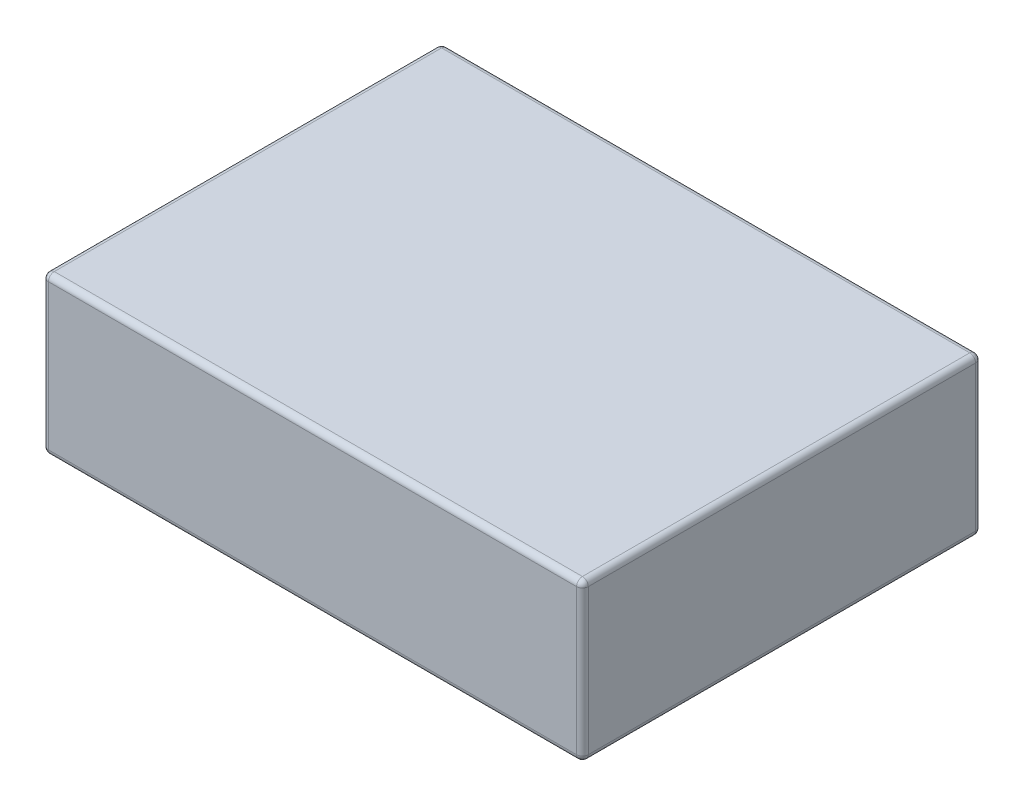
ISO-10303-21;
HEADER;
FILE_DESCRIPTION(('STEP AP214'),'2;1');
FILE_NAME('part.step','',(''),(''),'','','');
FILE_SCHEMA(('AUTOMOTIVE_DESIGN { 1 0 10303 214 1 1 1 1 }'));
ENDSEC;
DATA;
#1=APPLICATION_CONTEXT('core data for automotive mechanical design processes');
#2=APPLICATION_PROTOCOL_DEFINITION('international standard','automotive_design',2000,#1);
#3=PRODUCT_CONTEXT('',#1,'mechanical');
#4=PRODUCT('Part','Part','',(#3));
#5=PRODUCT_RELATED_PRODUCT_CATEGORY('part','',(#4));
#6=PRODUCT_DEFINITION_FORMATION('','',#4);
#7=PRODUCT_DEFINITION_CONTEXT('part definition',#1,'design');
#8=PRODUCT_DEFINITION('design','',#6,#7);
#9=PRODUCT_DEFINITION_SHAPE('','',#8);
#10=(LENGTH_UNIT() NAMED_UNIT(*) SI_UNIT(.MILLI.,.METRE.));
#11=(NAMED_UNIT(*) PLANE_ANGLE_UNIT() SI_UNIT($,.RADIAN.));
#12=(NAMED_UNIT(*) SI_UNIT($,.STERADIAN.) SOLID_ANGLE_UNIT());
#13=UNCERTAINTY_MEASURE_WITH_UNIT(LENGTH_MEASURE(1.E-05),#10,'distance_accuracy_value','');
#14=(GEOMETRIC_REPRESENTATION_CONTEXT(3) GLOBAL_UNCERTAINTY_ASSIGNED_CONTEXT((#13)) GLOBAL_UNIT_ASSIGNED_CONTEXT((#10,
#11,#12)) REPRESENTATION_CONTEXT('',''));
#15=CARTESIAN_POINT('',(0.,0.,0.));
#16=DIRECTION('',(0.,0.,1.));
#17=DIRECTION('',(1.,0.,0.));
#18=AXIS2_PLACEMENT_3D('',#15,#16,#17);
#19=CARTESIAN_POINT('',(0.,6.7,0.));
#20=DIRECTION('',(1.,0.,0.));
#21=DIRECTION('',(0.,0.,-1.));
#22=AXIS2_PLACEMENT_3D('',#19,#20,#21);
#23=PLANE('',#22);
#24=DIRECTION('',(0.,-1.,0.));
#25=VECTOR('',#24,1.);
#26=CARTESIAN_POINT('',(0.,6.7,-16.75));
#27=LINE('',#26,#25);
#28=CARTESIAN_POINT('',(0.,6.45,-16.75));
#29=VERTEX_POINT('',#28);
#30=CARTESIAN_POINT('',(0.,0.25,-16.75));
#31=VERTEX_POINT('',#30);
#32=EDGE_CURVE('E136',#29,#31,#27,.T.);
#33=ORIENTED_EDGE('',*,*,#32,.T.);
#34=DIRECTION('',(0.,0.,1.));
#35=VECTOR('',#34,1.);
#36=CARTESIAN_POINT('',(0.,0.25,0.));
#37=LINE('',#36,#35);
#38=CARTESIAN_POINT('',(0.,0.25,-0.25));
#39=VERTEX_POINT('',#38);
#40=EDGE_CURVE('E132',#31,#39,#37,.T.);
#41=ORIENTED_EDGE('',*,*,#40,.T.);
#42=DIRECTION('',(0.,-1.,0.));
#43=VECTOR('',#42,1.);
#44=CARTESIAN_POINT('',(0.,6.7,-0.25));
#45=LINE('',#44,#43);
#46=CARTESIAN_POINT('',(0.,6.45,-0.25));
#47=VERTEX_POINT('',#46);
#48=EDGE_CURVE('E127',#39,#47,#45,.F.);
#49=ORIENTED_EDGE('',*,*,#48,.T.);
#50=DIRECTION('',(0.,0.,1.));
#51=VECTOR('',#50,1.);
#52=CARTESIAN_POINT('',(0.,6.45,0.));
#53=LINE('',#52,#51);
#54=EDGE_CURVE('E129',#47,#29,#53,.F.);
#55=ORIENTED_EDGE('',*,*,#54,.T.);
#56=EDGE_LOOP('',(#33,#41,#49,#55));
#57=FACE_BOUND('',#56,.T.);
#58=ADVANCED_FACE('F38',(#57),#23,.F.);
#59=CARTESIAN_POINT('',(0.,6.7,0.));
#60=DIRECTION('',(0.,0.,-1.));
#61=DIRECTION('',(-1.,0.,0.));
#62=AXIS2_PLACEMENT_3D('',#59,#60,#61);
#63=PLANE('',#62);
#64=DIRECTION('',(1.,0.,0.));
#65=VECTOR('',#64,1.);
#66=CARTESIAN_POINT('',(23.,0.25,0.));
#67=LINE('',#66,#65);
#68=CARTESIAN_POINT('',(0.25,0.25,0.));
#69=VERTEX_POINT('',#68);
#70=CARTESIAN_POINT('',(22.75,0.25,0.));
#71=VERTEX_POINT('',#70);
#72=EDGE_CURVE('E232',#69,#71,#67,.T.);
#73=ORIENTED_EDGE('',*,*,#72,.T.);
#74=DIRECTION('',(0.,-1.,0.));
#75=VECTOR('',#74,1.);
#76=CARTESIAN_POINT('',(22.75,6.7,0.));
#77=LINE('',#76,#75);
#78=CARTESIAN_POINT('',(22.75,6.45,0.));
#79=VERTEX_POINT('',#78);
#80=EDGE_CURVE('E234',#71,#79,#77,.F.);
#81=ORIENTED_EDGE('',*,*,#80,.T.);
#82=DIRECTION('',(1.,0.,0.));
#83=VECTOR('',#82,1.);
#84=CARTESIAN_POINT('',(0.,6.45,0.));
#85=LINE('',#84,#83);
#86=CARTESIAN_POINT('',(0.25,6.45,0.));
#87=VERTEX_POINT('',#86);
#88=EDGE_CURVE('E225',#79,#87,#85,.F.);
#89=ORIENTED_EDGE('',*,*,#88,.T.);
#90=DIRECTION('',(0.,-1.,0.));
#91=VECTOR('',#90,1.);
#92=CARTESIAN_POINT('',(0.25,6.7,0.));
#93=LINE('',#92,#91);
#94=EDGE_CURVE('E157',#87,#69,#93,.T.);
#95=ORIENTED_EDGE('',*,*,#94,.T.);
#96=EDGE_LOOP('',(#73,#81,#89,#95));
#97=FACE_BOUND('',#96,.T.);
#98=ADVANCED_FACE('F326',(#97),#63,.F.);
#99=CARTESIAN_POINT('',(23.,6.7,0.));
#100=DIRECTION('',(-1.,0.,0.));
#101=DIRECTION('',(0.,0.,1.));
#102=AXIS2_PLACEMENT_3D('',#99,#100,#101);
#103=PLANE('',#102);
#104=DIRECTION('',(0.,0.,-1.));
#105=VECTOR('',#104,1.);
#106=CARTESIAN_POINT('',(23.,0.25,-17.));
#107=LINE('',#106,#105);
#108=CARTESIAN_POINT('',(23.,0.25,-0.25));
#109=VERTEX_POINT('',#108);
#110=CARTESIAN_POINT('',(23.,0.25,-16.75));
#111=VERTEX_POINT('',#110);
#112=EDGE_CURVE('E221',#109,#111,#107,.T.);
#113=ORIENTED_EDGE('',*,*,#112,.T.);
#114=DIRECTION('',(0.,-1.,0.));
#115=VECTOR('',#114,1.);
#116=CARTESIAN_POINT('',(23.,6.7,-16.75));
#117=LINE('',#116,#115);
#118=CARTESIAN_POINT('',(23.,6.45,-16.75));
#119=VERTEX_POINT('',#118);
#120=EDGE_CURVE('E218',#111,#119,#117,.F.);
#121=ORIENTED_EDGE('',*,*,#120,.T.);
#122=DIRECTION('',(0.,0.,-1.));
#123=VECTOR('',#122,1.);
#124=CARTESIAN_POINT('',(23.,6.45,0.));
#125=LINE('',#124,#123);
#126=CARTESIAN_POINT('',(23.,6.45,-0.25));
#127=VERTEX_POINT('',#126);
#128=EDGE_CURVE('E211',#119,#127,#125,.F.);
#129=ORIENTED_EDGE('',*,*,#128,.T.);
#130=DIRECTION('',(0.,-1.,0.));
#131=VECTOR('',#130,1.);
#132=CARTESIAN_POINT('',(23.,6.7,-0.25));
#133=LINE('',#132,#131);
#134=EDGE_CURVE('E214',#127,#109,#133,.T.);
#135=ORIENTED_EDGE('',*,*,#134,.T.);
#136=EDGE_LOOP('',(#113,#121,#129,#135));
#137=FACE_BOUND('',#136,.T.);
#138=ADVANCED_FACE('F219',(#137),#103,.F.);
#139=CARTESIAN_POINT('',(0.,6.7,-17.));
#140=DIRECTION('',(0.,0.,1.));
#141=DIRECTION('',(1.,0.,0.));
#142=AXIS2_PLACEMENT_3D('',#139,#140,#141);
#143=PLANE('',#142);
#144=DIRECTION('',(-1.,0.,0.));
#145=VECTOR('',#144,1.);
#146=CARTESIAN_POINT('',(0.,0.25,-17.));
#147=LINE('',#146,#145);
#148=CARTESIAN_POINT('',(22.75,0.25,-17.));
#149=VERTEX_POINT('',#148);
#150=CARTESIAN_POINT('',(0.25,0.25,-17.));
#151=VERTEX_POINT('',#150);
#152=EDGE_CURVE('E285',#149,#151,#147,.T.);
#153=ORIENTED_EDGE('',*,*,#152,.T.);
#154=DIRECTION('',(0.,-1.,0.));
#155=VECTOR('',#154,1.);
#156=CARTESIAN_POINT('',(0.25,6.7,-17.));
#157=LINE('',#156,#155);
#158=CARTESIAN_POINT('',(0.25,6.45,-17.));
#159=VERTEX_POINT('',#158);
#160=EDGE_CURVE('E215',#151,#159,#157,.F.);
#161=ORIENTED_EDGE('',*,*,#160,.T.);
#162=DIRECTION('',(-1.,0.,0.));
#163=VECTOR('',#162,1.);
#164=CARTESIAN_POINT('',(0.,6.45,-17.));
#165=LINE('',#164,#163);
#166=CARTESIAN_POINT('',(22.75,6.45,-17.));
#167=VERTEX_POINT('',#166);
#168=EDGE_CURVE('E278',#159,#167,#165,.F.);
#169=ORIENTED_EDGE('',*,*,#168,.T.);
#170=DIRECTION('',(0.,-1.,0.));
#171=VECTOR('',#170,1.);
#172=CARTESIAN_POINT('',(22.75,6.7,-17.));
#173=LINE('',#172,#171);
#174=EDGE_CURVE('E280',#167,#149,#173,.T.);
#175=ORIENTED_EDGE('',*,*,#174,.T.);
#176=EDGE_LOOP('',(#153,#161,#169,#175));
#177=FACE_BOUND('',#176,.T.);
#178=ADVANCED_FACE('F310',(#177),#143,.F.);
#179=CARTESIAN_POINT('',(0.,6.7,0.));
#180=DIRECTION('',(0.,-1.,0.));
#181=DIRECTION('',(0.,0.,-1.));
#182=AXIS2_PLACEMENT_3D('',#179,#180,#181);
#183=PLANE('',#182);
#184=DIRECTION('',(-1.,0.,0.));
#185=VECTOR('',#184,1.);
#186=CARTESIAN_POINT('',(0.,6.7,-16.75));
#187=LINE('',#186,#185);
#188=CARTESIAN_POINT('',(22.75,6.7,-16.75));
#189=VERTEX_POINT('',#188);
#190=CARTESIAN_POINT('',(0.25,6.7,-16.75));
#191=VERTEX_POINT('',#190);
#192=EDGE_CURVE('E47',#189,#191,#187,.T.);
#193=ORIENTED_EDGE('',*,*,#192,.T.);
#194=DIRECTION('',(0.,0.,1.));
#195=VECTOR('',#194,1.);
#196=CARTESIAN_POINT('',(0.25,6.7,0.));
#197=LINE('',#196,#195);
#198=CARTESIAN_POINT('',(0.25,6.7,-0.25));
#199=VERTEX_POINT('',#198);
#200=EDGE_CURVE('E11',#191,#199,#197,.T.);
#201=ORIENTED_EDGE('',*,*,#200,.T.);
#202=DIRECTION('',(1.,0.,0.));
#203=VECTOR('',#202,1.);
#204=CARTESIAN_POINT('',(0.,6.7,-0.25));
#205=LINE('',#204,#203);
#206=CARTESIAN_POINT('',(22.75,6.7,-0.25));
#207=VERTEX_POINT('',#206);
#208=EDGE_CURVE('E237',#199,#207,#205,.T.);
#209=ORIENTED_EDGE('',*,*,#208,.T.);
#210=DIRECTION('',(0.,0.,-1.));
#211=VECTOR('',#210,1.);
#212=CARTESIAN_POINT('',(22.75,6.7,0.));
#213=LINE('',#212,#211);
#214=EDGE_CURVE('E58',#207,#189,#213,.T.);
#215=ORIENTED_EDGE('',*,*,#214,.T.);
#216=EDGE_LOOP('',(#193,#201,#209,#215));
#217=FACE_BOUND('',#216,.T.);
#218=ADVANCED_FACE('F489',(#217),#183,.F.);
#219=CARTESIAN_POINT('',(0.,0.,0.));
#220=DIRECTION('',(0.,-1.,0.));
#221=DIRECTION('',(0.,0.,-1.));
#222=AXIS2_PLACEMENT_3D('',#219,#220,#221);
#223=PLANE('',#222);
#224=DIRECTION('',(1.,0.,0.));
#225=VECTOR('',#224,1.);
#226=CARTESIAN_POINT('',(0.,0.,-0.25));
#227=LINE('',#226,#225);
#228=CARTESIAN_POINT('',(22.75,0.,-0.25));
#229=VERTEX_POINT('',#228);
#230=CARTESIAN_POINT('',(0.25,0.,-0.25));
#231=VERTEX_POINT('',#230);
#232=EDGE_CURVE('E274',#229,#231,#227,.F.);
#233=ORIENTED_EDGE('',*,*,#232,.T.);
#234=DIRECTION('',(0.,0.,1.));
#235=VECTOR('',#234,1.);
#236=CARTESIAN_POINT('',(0.25,0.,-17.));
#237=LINE('',#236,#235);
#238=CARTESIAN_POINT('',(0.25,0.,-16.75));
#239=VERTEX_POINT('',#238);
#240=EDGE_CURVE('E268',#231,#239,#237,.F.);
#241=ORIENTED_EDGE('',*,*,#240,.T.);
#242=DIRECTION('',(-1.,0.,0.));
#243=VECTOR('',#242,1.);
#244=CARTESIAN_POINT('',(23.,0.,-16.75));
#245=LINE('',#244,#243);
#246=CARTESIAN_POINT('',(22.75,0.,-16.75));
#247=VERTEX_POINT('',#246);
#248=EDGE_CURVE('E262',#239,#247,#245,.F.);
#249=ORIENTED_EDGE('',*,*,#248,.T.);
#250=DIRECTION('',(0.,0.,-1.));
#251=VECTOR('',#250,1.);
#252=CARTESIAN_POINT('',(22.75,0.,0.));
#253=LINE('',#252,#251);
#254=EDGE_CURVE('E269',#247,#229,#253,.F.);
#255=ORIENTED_EDGE('',*,*,#254,.T.);
#256=EDGE_LOOP('',(#233,#241,#249,#255));
#257=FACE_BOUND('',#256,.T.);
#258=ADVANCED_FACE('F272',(#257),#223,.T.);
#259=CARTESIAN_POINT('',(22.75,6.45,0.));
#260=DIRECTION('',(0.,0.,-1.));
#261=DIRECTION('',(-1.,0.,0.));
#262=AXIS2_PLACEMENT_3D('',#259,#260,#261);
#263=CYLINDRICAL_SURFACE('',#262,0.25);
#264=CARTESIAN_POINT('',(22.75,6.45,-16.75));
#265=DIRECTION('',(0.,0.,-1.));
#266=DIRECTION('',(-1.,0.,0.));
#267=AXIS2_PLACEMENT_3D('',#264,#265,#266);
#268=CIRCLE('',#267,0.25);
#269=EDGE_CURVE('E42',#189,#119,#268,.T.);
#270=ORIENTED_EDGE('',*,*,#269,.F.);
#271=ORIENTED_EDGE('',*,*,#214,.F.);
#272=CARTESIAN_POINT('',(22.75,6.45,-0.25));
#273=DIRECTION('',(0.,0.,1.));
#274=DIRECTION('',(1.,0.,0.));
#275=AXIS2_PLACEMENT_3D('',#272,#273,#274);
#276=CIRCLE('',#275,0.25);
#277=EDGE_CURVE('E197',#127,#207,#276,.T.);
#278=ORIENTED_EDGE('',*,*,#277,.F.);
#279=ORIENTED_EDGE('',*,*,#128,.F.);
#280=EDGE_LOOP('',(#270,#271,#278,#279));
#281=FACE_BOUND('',#280,.T.);
#282=ADVANCED_FACE('F40',(#281),#263,.T.);
#283=CARTESIAN_POINT('',(22.75,6.45,-16.75));
#284=DIRECTION('',(0.,0.,1.));
#285=DIRECTION('',(1.,0.,0.));
#286=AXIS2_PLACEMENT_3D('',#283,#284,#285);
#287=SPHERICAL_SURFACE('',#286,0.25);
#288=CARTESIAN_POINT('',(22.75,6.45,-16.75));
#289=DIRECTION('',(1.,0.,0.));
#290=DIRECTION('',(0.,0.,-1.));
#291=AXIS2_PLACEMENT_3D('',#288,#289,#290);
#292=CIRCLE('',#291,0.25);
#293=EDGE_CURVE('E193',#189,#167,#292,.F.);
#294=ORIENTED_EDGE('',*,*,#293,.F.);
#295=ORIENTED_EDGE('',*,*,#269,.T.);
#296=CARTESIAN_POINT('',(22.75,6.45,-16.75));
#297=DIRECTION('',(0.,1.,0.));
#298=DIRECTION('',(0.,0.,1.));
#299=AXIS2_PLACEMENT_3D('',#296,#297,#298);
#300=CIRCLE('',#299,0.25);
#301=EDGE_CURVE('E196',#167,#119,#300,.F.);
#302=ORIENTED_EDGE('',*,*,#301,.F.);
#303=EDGE_LOOP('',(#294,#295,#302));
#304=FACE_BOUND('',#303,.T.);
#305=ADVANCED_FACE('F208',(#304),#287,.T.);
#306=CARTESIAN_POINT('',(22.75,6.45,-0.25));
#307=DIRECTION('',(0.,0.,1.));
#308=DIRECTION('',(1.,0.,0.));
#309=AXIS2_PLACEMENT_3D('',#306,#307,#308);
#310=SPHERICAL_SURFACE('',#309,0.25);
#311=CARTESIAN_POINT('',(22.75,6.45,-0.25));
#312=DIRECTION('',(0.,1.,0.));
#313=DIRECTION('',(0.,0.,1.));
#314=AXIS2_PLACEMENT_3D('',#311,#312,#313);
#315=CIRCLE('',#314,0.25);
#316=EDGE_CURVE('E187',#127,#79,#315,.F.);
#317=ORIENTED_EDGE('',*,*,#316,.F.);
#318=ORIENTED_EDGE('',*,*,#277,.T.);
#319=CARTESIAN_POINT('',(22.75,6.45,-0.25));
#320=DIRECTION('',(1.,0.,0.));
#321=DIRECTION('',(0.,0.,-1.));
#322=AXIS2_PLACEMENT_3D('',#319,#320,#321);
#323=CIRCLE('',#322,0.25);
#324=EDGE_CURVE('E190',#79,#207,#323,.F.);
#325=ORIENTED_EDGE('',*,*,#324,.F.);
#326=EDGE_LOOP('',(#317,#318,#325));
#327=FACE_BOUND('',#326,.T.);
#328=ADVANCED_FACE('F462',(#327),#310,.T.);
#329=CARTESIAN_POINT('',(22.75,6.7,-16.75));
#330=DIRECTION('',(0.,-1.,0.));
#331=DIRECTION('',(0.,0.,-1.));
#332=AXIS2_PLACEMENT_3D('',#329,#330,#331);
#333=CYLINDRICAL_SURFACE('',#332,0.25);
#334=ORIENTED_EDGE('',*,*,#301,.T.);
#335=ORIENTED_EDGE('',*,*,#120,.F.);
#336=CARTESIAN_POINT('',(22.75,0.25,-16.75));
#337=DIRECTION('',(0.,-1.,0.));
#338=DIRECTION('',(0.,0.,-1.));
#339=AXIS2_PLACEMENT_3D('',#336,#337,#338);
#340=CIRCLE('',#339,0.25);
#341=EDGE_CURVE('E181',#149,#111,#340,.T.);
#342=ORIENTED_EDGE('',*,*,#341,.F.);
#343=ORIENTED_EDGE('',*,*,#174,.F.);
#344=EDGE_LOOP('',(#334,#335,#342,#343));
#345=FACE_BOUND('',#344,.T.);
#346=ADVANCED_FACE('F312',(#345),#333,.T.);
#347=CARTESIAN_POINT('',(0.,6.45,-16.75));
#348=DIRECTION('',(-1.,0.,0.));
#349=DIRECTION('',(0.,0.,1.));
#350=AXIS2_PLACEMENT_3D('',#347,#348,#349);
#351=CYLINDRICAL_SURFACE('',#350,0.25);
#352=ORIENTED_EDGE('',*,*,#293,.T.);
#353=ORIENTED_EDGE('',*,*,#168,.F.);
#354=CARTESIAN_POINT('',(0.25,6.45,-16.75));
#355=DIRECTION('',(-1.,0.,0.));
#356=DIRECTION('',(0.,0.,1.));
#357=AXIS2_PLACEMENT_3D('',#354,#355,#356);
#358=CIRCLE('',#357,0.25);
#359=EDGE_CURVE('E178',#191,#159,#358,.T.);
#360=ORIENTED_EDGE('',*,*,#359,.F.);
#361=ORIENTED_EDGE('',*,*,#192,.F.);
#362=EDGE_LOOP('',(#352,#353,#360,#361));
#363=FACE_BOUND('',#362,.T.);
#364=ADVANCED_FACE('F446',(#363),#351,.T.);
#365=CARTESIAN_POINT('',(0.25,6.45,0.));
#366=DIRECTION('',(0.,0.,1.));
#367=DIRECTION('',(1.,0.,0.));
#368=AXIS2_PLACEMENT_3D('',#365,#366,#367);
#369=CYLINDRICAL_SURFACE('',#368,0.25);
#370=CARTESIAN_POINT('',(0.25,6.45,-0.25));
#371=DIRECTION('',(0.,0.,1.));
#372=DIRECTION('',(1.,0.,0.));
#373=AXIS2_PLACEMENT_3D('',#370,#371,#372);
#374=CIRCLE('',#373,0.25);
#375=EDGE_CURVE('E142',#199,#47,#374,.T.);
#376=ORIENTED_EDGE('',*,*,#375,.F.);
#377=ORIENTED_EDGE('',*,*,#200,.F.);
#378=CARTESIAN_POINT('',(0.25,6.45,-16.75));
#379=DIRECTION('',(0.,0.,-1.));
#380=DIRECTION('',(-1.,0.,0.));
#381=AXIS2_PLACEMENT_3D('',#378,#379,#380);
#382=CIRCLE('',#381,0.25);
#383=EDGE_CURVE('E145',#29,#191,#382,.T.);
#384=ORIENTED_EDGE('',*,*,#383,.F.);
#385=ORIENTED_EDGE('',*,*,#54,.F.);
#386=EDGE_LOOP('',(#376,#377,#384,#385));
#387=FACE_BOUND('',#386,.T.);
#388=ADVANCED_FACE('F141',(#387),#369,.T.);
#389=CARTESIAN_POINT('',(0.,6.45,-0.25));
#390=DIRECTION('',(1.,0.,0.));
#391=DIRECTION('',(0.,0.,-1.));
#392=AXIS2_PLACEMENT_3D('',#389,#390,#391);
#393=CYLINDRICAL_SURFACE('',#392,0.25);
#394=ORIENTED_EDGE('',*,*,#324,.T.);
#395=ORIENTED_EDGE('',*,*,#208,.F.);
#396=CARTESIAN_POINT('',(0.25,6.45,-0.25));
#397=DIRECTION('',(-1.,0.,0.));
#398=DIRECTION('',(0.,0.,1.));
#399=AXIS2_PLACEMENT_3D('',#396,#397,#398);
#400=CIRCLE('',#399,0.25);
#401=EDGE_CURVE('E154',#87,#199,#400,.T.);
#402=ORIENTED_EDGE('',*,*,#401,.F.);
#403=ORIENTED_EDGE('',*,*,#88,.F.);
#404=EDGE_LOOP('',(#394,#395,#402,#403));
#405=FACE_BOUND('',#404,.T.);
#406=ADVANCED_FACE('F430',(#405),#393,.T.);
#407=CARTESIAN_POINT('',(22.75,6.7,-0.25));
#408=DIRECTION('',(0.,-1.,0.));
#409=DIRECTION('',(0.,0.,-1.));
#410=AXIS2_PLACEMENT_3D('',#407,#408,#409);
#411=CYLINDRICAL_SURFACE('',#410,0.25);
#412=ORIENTED_EDGE('',*,*,#316,.T.);
#413=ORIENTED_EDGE('',*,*,#80,.F.);
#414=CARTESIAN_POINT('',(22.75,0.25,-0.25));
#415=DIRECTION('',(0.,-1.,0.));
#416=DIRECTION('',(0.,0.,-1.));
#417=AXIS2_PLACEMENT_3D('',#414,#415,#416);
#418=CIRCLE('',#417,0.25);
#419=EDGE_CURVE('E173',#109,#71,#418,.T.);
#420=ORIENTED_EDGE('',*,*,#419,.F.);
#421=ORIENTED_EDGE('',*,*,#134,.F.);
#422=EDGE_LOOP('',(#412,#413,#420,#421));
#423=FACE_BOUND('',#422,.T.);
#424=ADVANCED_FACE('F296',(#423),#411,.T.);
#425=CARTESIAN_POINT('',(22.75,0.25,0.));
#426=DIRECTION('',(0.,0.,1.));
#427=DIRECTION('',(1.,0.,0.));
#428=AXIS2_PLACEMENT_3D('',#425,#426,#427);
#429=CYLINDRICAL_SURFACE('',#428,0.25);
#430=CARTESIAN_POINT('',(22.75,0.25,-16.75));
#431=DIRECTION('',(0.,0.,-1.));
#432=DIRECTION('',(-1.,0.,0.));
#433=AXIS2_PLACEMENT_3D('',#430,#431,#432);
#434=CIRCLE('',#433,0.25);
#435=EDGE_CURVE('E184',#111,#247,#434,.T.);
#436=ORIENTED_EDGE('',*,*,#435,.F.);
#437=ORIENTED_EDGE('',*,*,#112,.F.);
#438=CARTESIAN_POINT('',(22.75,0.25,-0.25));
#439=DIRECTION('',(0.,0.,1.));
#440=DIRECTION('',(1.,0.,0.));
#441=AXIS2_PLACEMENT_3D('',#438,#439,#440);
#442=CIRCLE('',#441,0.25);
#443=EDGE_CURVE('E170',#229,#109,#442,.T.);
#444=ORIENTED_EDGE('',*,*,#443,.F.);
#445=ORIENTED_EDGE('',*,*,#254,.F.);
#446=EDGE_LOOP('',(#436,#437,#444,#445));
#447=FACE_BOUND('',#446,.T.);
#448=ADVANCED_FACE('F293',(#447),#429,.T.);
#449=CARTESIAN_POINT('',(22.75,0.25,-16.75));
#450=DIRECTION('',(0.,0.,1.));
#451=DIRECTION('',(1.,0.,0.));
#452=AXIS2_PLACEMENT_3D('',#449,#450,#451);
#453=SPHERICAL_SURFACE('',#452,0.25);
#454=ORIENTED_EDGE('',*,*,#341,.T.);
#455=ORIENTED_EDGE('',*,*,#435,.T.);
#456=CARTESIAN_POINT('',(22.75,0.25,-16.75));
#457=DIRECTION('',(1.,0.,0.));
#458=DIRECTION('',(0.,0.,-1.));
#459=AXIS2_PLACEMENT_3D('',#456,#457,#458);
#460=CIRCLE('',#459,0.25);
#461=EDGE_CURVE('E161',#149,#247,#460,.F.);
#462=ORIENTED_EDGE('',*,*,#461,.F.);
#463=EDGE_LOOP('',(#454,#455,#462));
#464=FACE_BOUND('',#463,.T.);
#465=ADVANCED_FACE('F314',(#464),#453,.T.);
#466=CARTESIAN_POINT('',(0.25,6.45,-16.75));
#467=DIRECTION('',(0.,0.,1.));
#468=DIRECTION('',(1.,0.,0.));
#469=AXIS2_PLACEMENT_3D('',#466,#467,#468);
#470=SPHERICAL_SURFACE('',#469,0.25);
#471=ORIENTED_EDGE('',*,*,#383,.T.);
#472=ORIENTED_EDGE('',*,*,#359,.T.);
#473=CARTESIAN_POINT('',(0.25,6.45,-16.75));
#474=DIRECTION('',(0.,1.,0.));
#475=DIRECTION('',(0.,0.,1.));
#476=AXIS2_PLACEMENT_3D('',#473,#474,#475);
#477=CIRCLE('',#476,0.25);
#478=EDGE_CURVE('E158',#29,#159,#477,.F.);
#479=ORIENTED_EDGE('',*,*,#478,.F.);
#480=EDGE_LOOP('',(#471,#472,#479));
#481=FACE_BOUND('',#480,.T.);
#482=ADVANCED_FACE('F316',(#481),#470,.T.);
#483=CARTESIAN_POINT('',(0.25,6.45,-0.25));
#484=DIRECTION('',(0.,0.,1.));
#485=DIRECTION('',(1.,0.,0.));
#486=AXIS2_PLACEMENT_3D('',#483,#484,#485);
#487=SPHERICAL_SURFACE('',#486,0.25);
#488=ORIENTED_EDGE('',*,*,#401,.T.);
#489=ORIENTED_EDGE('',*,*,#375,.T.);
#490=CARTESIAN_POINT('',(0.25,6.45,-0.25));
#491=DIRECTION('',(0.,1.,0.));
#492=DIRECTION('',(0.,0.,1.));
#493=AXIS2_PLACEMENT_3D('',#490,#491,#492);
#494=CIRCLE('',#493,0.25);
#495=EDGE_CURVE('E151',#87,#47,#494,.F.);
#496=ORIENTED_EDGE('',*,*,#495,.F.);
#497=EDGE_LOOP('',(#488,#489,#496));
#498=FACE_BOUND('',#497,.T.);
#499=ADVANCED_FACE('F150',(#498),#487,.T.);
#500=CARTESIAN_POINT('',(22.75,0.25,-0.25));
#501=DIRECTION('',(0.,0.,1.));
#502=DIRECTION('',(1.,0.,0.));
#503=AXIS2_PLACEMENT_3D('',#500,#501,#502);
#504=SPHERICAL_SURFACE('',#503,0.25);
#505=ORIENTED_EDGE('',*,*,#443,.T.);
#506=ORIENTED_EDGE('',*,*,#419,.T.);
#507=CARTESIAN_POINT('',(22.75,0.25,-0.25));
#508=DIRECTION('',(1.,0.,0.));
#509=DIRECTION('',(0.,0.,-1.));
#510=AXIS2_PLACEMENT_3D('',#507,#508,#509);
#511=CIRCLE('',#510,0.25);
#512=EDGE_CURVE('E159',#229,#71,#511,.F.);
#513=ORIENTED_EDGE('',*,*,#512,.F.);
#514=EDGE_LOOP('',(#505,#506,#513));
#515=FACE_BOUND('',#514,.T.);
#516=ADVANCED_FACE('F298',(#515),#504,.T.);
#517=CARTESIAN_POINT('',(0.,0.25,-16.75));
#518=DIRECTION('',(1.,0.,0.));
#519=DIRECTION('',(0.,0.,-1.));
#520=AXIS2_PLACEMENT_3D('',#517,#518,#519);
#521=CYLINDRICAL_SURFACE('',#520,0.25);
#522=ORIENTED_EDGE('',*,*,#461,.T.);
#523=ORIENTED_EDGE('',*,*,#248,.F.);
#524=CARTESIAN_POINT('',(0.25,0.25,-16.75));
#525=DIRECTION('',(-1.,0.,0.));
#526=DIRECTION('',(0.,0.,1.));
#527=AXIS2_PLACEMENT_3D('',#524,#525,#526);
#528=CIRCLE('',#527,0.25);
#529=EDGE_CURVE('E164',#151,#239,#528,.T.);
#530=ORIENTED_EDGE('',*,*,#529,.F.);
#531=ORIENTED_EDGE('',*,*,#152,.F.);
#532=EDGE_LOOP('',(#522,#523,#530,#531));
#533=FACE_BOUND('',#532,.T.);
#534=ADVANCED_FACE('F264',(#533),#521,.T.);
#535=CARTESIAN_POINT('',(0.25,6.7,-16.75));
#536=DIRECTION('',(0.,-1.,0.));
#537=DIRECTION('',(0.,0.,-1.));
#538=AXIS2_PLACEMENT_3D('',#535,#536,#537);
#539=CYLINDRICAL_SURFACE('',#538,0.25);
#540=ORIENTED_EDGE('',*,*,#478,.T.);
#541=ORIENTED_EDGE('',*,*,#160,.F.);
#542=CARTESIAN_POINT('',(0.25,0.25,-16.75));
#543=DIRECTION('',(0.,-1.,0.));
#544=DIRECTION('',(0.,0.,-1.));
#545=AXIS2_PLACEMENT_3D('',#542,#543,#544);
#546=CIRCLE('',#545,0.25);
#547=EDGE_CURVE('E251',#31,#151,#546,.T.);
#548=ORIENTED_EDGE('',*,*,#547,.F.);
#549=ORIENTED_EDGE('',*,*,#32,.F.);
#550=EDGE_LOOP('',(#540,#541,#548,#549));
#551=FACE_BOUND('',#550,.T.);
#552=ADVANCED_FACE('F308',(#551),#539,.T.);
#553=CARTESIAN_POINT('',(0.25,6.7,-0.25));
#554=DIRECTION('',(0.,-1.,0.));
#555=DIRECTION('',(0.,0.,-1.));
#556=AXIS2_PLACEMENT_3D('',#553,#554,#555);
#557=CYLINDRICAL_SURFACE('',#556,0.25);
#558=ORIENTED_EDGE('',*,*,#495,.T.);
#559=ORIENTED_EDGE('',*,*,#48,.F.);
#560=CARTESIAN_POINT('',(0.25,0.25,-0.25));
#561=DIRECTION('',(0.,-1.,0.));
#562=DIRECTION('',(0.,0.,-1.));
#563=AXIS2_PLACEMENT_3D('',#560,#561,#562);
#564=CIRCLE('',#563,0.25);
#565=EDGE_CURVE('E248',#69,#39,#564,.T.);
#566=ORIENTED_EDGE('',*,*,#565,.F.);
#567=ORIENTED_EDGE('',*,*,#94,.F.);
#568=EDGE_LOOP('',(#558,#559,#566,#567));
#569=FACE_BOUND('',#568,.T.);
#570=ADVANCED_FACE('F156',(#569),#557,.T.);
#571=CARTESIAN_POINT('',(0.,0.25,-0.25));
#572=DIRECTION('',(-1.,0.,0.));
#573=DIRECTION('',(0.,0.,1.));
#574=AXIS2_PLACEMENT_3D('',#571,#572,#573);
#575=CYLINDRICAL_SURFACE('',#574,0.25);
#576=ORIENTED_EDGE('',*,*,#512,.T.);
#577=ORIENTED_EDGE('',*,*,#72,.F.);
#578=CARTESIAN_POINT('',(0.25,0.25,-0.25));
#579=DIRECTION('',(-1.,0.,0.));
#580=DIRECTION('',(0.,0.,1.));
#581=AXIS2_PLACEMENT_3D('',#578,#579,#580);
#582=CIRCLE('',#581,0.25);
#583=EDGE_CURVE('E245',#231,#69,#582,.T.);
#584=ORIENTED_EDGE('',*,*,#583,.F.);
#585=ORIENTED_EDGE('',*,*,#232,.F.);
#586=EDGE_LOOP('',(#576,#577,#584,#585));
#587=FACE_BOUND('',#586,.T.);
#588=ADVANCED_FACE('F301',(#587),#575,.T.);
#589=CARTESIAN_POINT('',(0.25,0.25,-16.75));
#590=DIRECTION('',(0.,0.,1.));
#591=DIRECTION('',(1.,0.,0.));
#592=AXIS2_PLACEMENT_3D('',#589,#590,#591);
#593=SPHERICAL_SURFACE('',#592,0.25);
#594=ORIENTED_EDGE('',*,*,#547,.T.);
#595=ORIENTED_EDGE('',*,*,#529,.T.);
#596=CARTESIAN_POINT('',(0.25,0.25,-16.75));
#597=DIRECTION('',(0.,0.,-1.));
#598=DIRECTION('',(-1.,0.,0.));
#599=AXIS2_PLACEMENT_3D('',#596,#597,#598);
#600=CIRCLE('',#599,0.25);
#601=EDGE_CURVE('E243',#31,#239,#600,.F.);
#602=ORIENTED_EDGE('',*,*,#601,.F.);
#603=EDGE_LOOP('',(#594,#595,#602));
#604=FACE_BOUND('',#603,.T.);
#605=ADVANCED_FACE('F258',(#604),#593,.T.);
#606=CARTESIAN_POINT('',(0.25,0.25,-0.25));
#607=DIRECTION('',(0.,0.,1.));
#608=DIRECTION('',(1.,0.,0.));
#609=AXIS2_PLACEMENT_3D('',#606,#607,#608);
#610=SPHERICAL_SURFACE('',#609,0.25);
#611=ORIENTED_EDGE('',*,*,#583,.T.);
#612=ORIENTED_EDGE('',*,*,#565,.T.);
#613=CARTESIAN_POINT('',(0.25,0.25,-0.25));
#614=DIRECTION('',(0.,0.,1.));
#615=DIRECTION('',(1.,0.,0.));
#616=AXIS2_PLACEMENT_3D('',#613,#614,#615);
#617=CIRCLE('',#616,0.25);
#618=EDGE_CURVE('E241',#231,#39,#617,.F.);
#619=ORIENTED_EDGE('',*,*,#618,.F.);
#620=EDGE_LOOP('',(#611,#612,#619));
#621=FACE_BOUND('',#620,.T.);
#622=ADVANCED_FACE('F338',(#621),#610,.T.);
#623=CARTESIAN_POINT('',(0.25,0.25,0.));
#624=DIRECTION('',(0.,0.,-1.));
#625=DIRECTION('',(-1.,0.,0.));
#626=AXIS2_PLACEMENT_3D('',#623,#624,#625);
#627=CYLINDRICAL_SURFACE('',#626,0.25);
#628=ORIENTED_EDGE('',*,*,#601,.T.);
#629=ORIENTED_EDGE('',*,*,#240,.F.);
#630=ORIENTED_EDGE('',*,*,#618,.T.);
#631=ORIENTED_EDGE('',*,*,#40,.F.);
#632=EDGE_LOOP('',(#628,#629,#630,#631));
#633=FACE_BOUND('',#632,.T.);
#634=ADVANCED_FACE('F335',(#633),#627,.T.);
#635=CLOSED_SHELL('',(#58,#98,#138,#178,#218,#258,#282,#305,#328,#346,#364,#388,#406,#424,#448,
#465,#482,#499,#516,#534,#552,#570,#588,#605,#622,#634));
#636=MANIFOLD_SOLID_BREP('B2',#635);
#637=ADVANCED_BREP_SHAPE_REPRESENTATION('',(#18,#636),#14);
#638=SHAPE_DEFINITION_REPRESENTATION(#9,#637);
ENDSEC;
END-ISO-10303-21;
